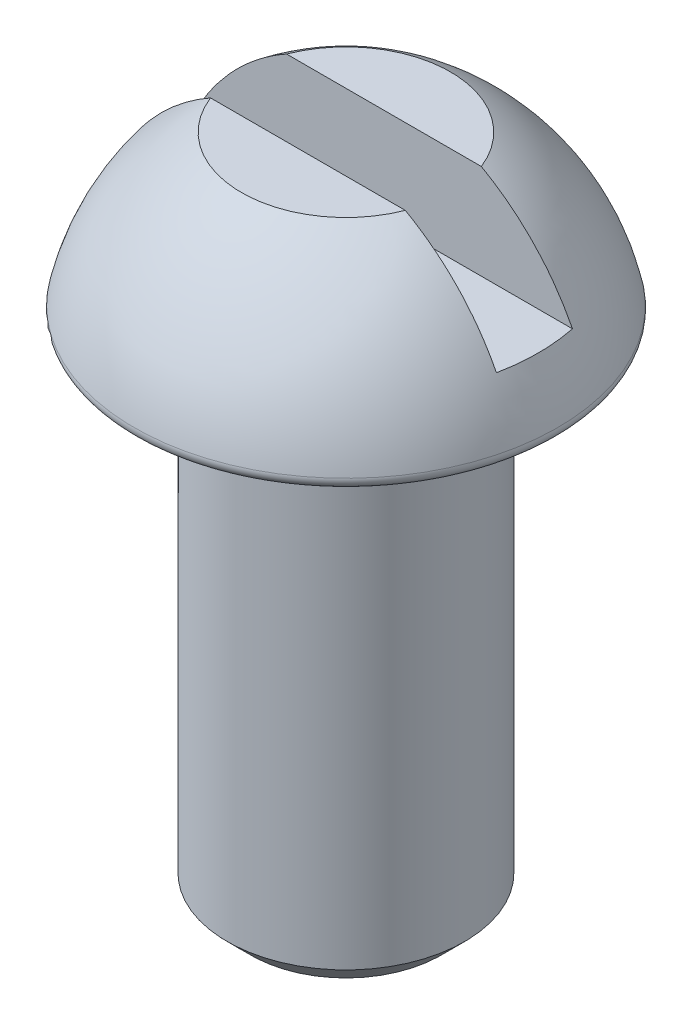
ISO-10303-21;
HEADER;
FILE_DESCRIPTION(('STEP AP214'),'2;1');
FILE_NAME('part.step','',(''),(''),'','','');
FILE_SCHEMA(('AUTOMOTIVE_DESIGN { 1 0 10303 214 1 1 1 1 }'));
ENDSEC;
DATA;
#1=APPLICATION_CONTEXT('core data for automotive mechanical design processes');
#2=APPLICATION_PROTOCOL_DEFINITION('international standard','automotive_design',2000,#1);
#3=PRODUCT_CONTEXT('',#1,'mechanical');
#4=PRODUCT('Part','Part','',(#3));
#5=PRODUCT_RELATED_PRODUCT_CATEGORY('part','',(#4));
#6=PRODUCT_DEFINITION_FORMATION('','',#4);
#7=PRODUCT_DEFINITION_CONTEXT('part definition',#1,'design');
#8=PRODUCT_DEFINITION('design','',#6,#7);
#9=PRODUCT_DEFINITION_SHAPE('','',#8);
#10=(LENGTH_UNIT() NAMED_UNIT(*) SI_UNIT(.MILLI.,.METRE.));
#11=(NAMED_UNIT(*) PLANE_ANGLE_UNIT() SI_UNIT($,.RADIAN.));
#12=(NAMED_UNIT(*) SI_UNIT($,.STERADIAN.) SOLID_ANGLE_UNIT());
#13=UNCERTAINTY_MEASURE_WITH_UNIT(LENGTH_MEASURE(1.E-05),#10,'distance_accuracy_value','');
#14=(GEOMETRIC_REPRESENTATION_CONTEXT(3) GLOBAL_UNCERTAINTY_ASSIGNED_CONTEXT((#13)) GLOBAL_UNIT_ASSIGNED_CONTEXT((#10,
#11,#12)) REPRESENTATION_CONTEXT('',''));
#15=CARTESIAN_POINT('',(0.,0.,0.));
#16=DIRECTION('',(0.,0.,1.));
#17=DIRECTION('',(1.,0.,0.));
#18=AXIS2_PLACEMENT_3D('',#15,#16,#17);
#19=CARTESIAN_POINT('',(0.,7.,0.));
#20=DIRECTION('',(0.,1.,0.));
#21=DIRECTION('',(0.,0.,1.));
#22=AXIS2_PLACEMENT_3D('',#19,#20,#21);
#23=PLANE('',#22);
#24=DIRECTION('',(-1.,0.,0.));
#25=VECTOR('',#24,1.);
#26=CARTESIAN_POINT('',(-2.5,7.,-0.4));
#27=LINE('',#26,#25);
#28=CARTESIAN_POINT('',(1.02469507659596,7.,-0.4));
#29=VERTEX_POINT('',#28);
#30=CARTESIAN_POINT('',(-1.02469507659596,7.,-0.4));
#31=VERTEX_POINT('',#30);
#32=EDGE_CURVE('E83',#29,#31,#27,.T.);
#33=ORIENTED_EDGE('',*,*,#32,.F.);
#34=CARTESIAN_POINT('',(0.,7.,0.));
#35=DIRECTION('',(0.,-1.,0.));
#36=DIRECTION('',(0.,0.,-1.));
#37=AXIS2_PLACEMENT_3D('',#34,#35,#36);
#38=CIRCLE('',#37,1.1);
#39=EDGE_CURVE('E90',#31,#29,#38,.T.);
#40=ORIENTED_EDGE('',*,*,#39,.F.);
#41=EDGE_LOOP('',(#33,#40));
#42=FACE_BOUND('',#41,.T.);
#43=ADVANCED_FACE('F29',(#42),#23,.T.);
#44=CARTESIAN_POINT('',(1.,0.,0.));
#45=DIRECTION('',(0.,-1.,0.));
#46=DIRECTION('',(0.,0.,-1.));
#47=AXIS2_PLACEMENT_3D('',#44,#45,#46);
#48=PLANE('',#47);
#49=CARTESIAN_POINT('',(0.,0.,0.));
#50=DIRECTION('',(0.,-1.,0.));
#51=DIRECTION('',(0.,0.,-1.));
#52=AXIS2_PLACEMENT_3D('',#49,#50,#51);
#53=CIRCLE('',#52,1.);
#54=CARTESIAN_POINT('',(0.,0.,-1.));
#55=VERTEX_POINT('',#54);
#56=EDGE_CURVE('E188',#55,#55,#53,.T.);
#57=ORIENTED_EDGE('',*,*,#56,.T.);
#58=EDGE_LOOP('',(#57));
#59=FACE_BOUND('',#58,.T.);
#60=ADVANCED_FACE('F31',(#59),#48,.T.);
#61=DIRECTION('',(1.,0.,0.));
#62=VECTOR('',#61,1.);
#63=CARTESIAN_POINT('',(-2.5,7.,0.4));
#64=LINE('',#63,#62);
#65=CARTESIAN_POINT('',(-1.02469507659596,7.,0.4));
#66=VERTEX_POINT('',#65);
#67=CARTESIAN_POINT('',(1.02469507659596,7.,0.4));
#68=VERTEX_POINT('',#67);
#69=EDGE_CURVE('E74',#66,#68,#64,.T.);
#70=ORIENTED_EDGE('',*,*,#69,.F.);
#71=EDGE_CURVE('E82',#68,#66,#38,.T.);
#72=ORIENTED_EDGE('',*,*,#71,.F.);
#73=EDGE_LOOP('',(#70,#72));
#74=FACE_BOUND('',#73,.T.);
#75=ADVANCED_FACE('F81',(#74),#23,.T.);
#76=CARTESIAN_POINT('',(0.,4.9063677010287,0.));
#77=DIRECTION('',(0.,-1.,0.));
#78=DIRECTION('',(0.,0.,-1.));
#79=AXIS2_PLACEMENT_3D('',#76,#77,#78);
#80=DEGENERATE_TOROIDAL_SURFACE('',#79,0.163412963696707,2.44530335953083,.F.);
#81=CARTESIAN_POINT('',(0.,7.28587906945526,-0.4));
#82=CARTESIAN_POINT('',(-0.0340393368764344,7.28587853967351,-0.4));
#83=CARTESIAN_POINT('',(-0.0680806385514161,7.28484475528946,-0.4));
#84=CARTESIAN_POINT('',(-0.136044239585214,7.28077151304844,-0.4));
#85=CARTESIAN_POINT('',(-0.169966512688445,7.27773163759928,-0.4));
#86=CARTESIAN_POINT('',(-0.27153522568853,7.26581085311434,-0.4));
#87=CARTESIAN_POINT('',(-0.338865413936364,7.25412964589655,-0.4));
#88=CARTESIAN_POINT('',(-0.466840374817371,7.22550258789054,-0.4));
#89=CARTESIAN_POINT('',(-0.527596444172791,7.20903942718526,-0.4));
#90=CARTESIAN_POINT('',(-0.647532675073714,7.17108725806298,-0.4));
#91=CARTESIAN_POINT('',(-0.706712127812102,7.14959603024963,-0.4));
#92=CARTESIAN_POINT('',(-0.881413612269339,7.07797897531619,-0.4));
#93=CARTESIAN_POINT('',(-0.994091656053262,7.02071142271362,-0.4));
#94=CARTESIAN_POINT('',(-1.21116046265258,6.88771713623111,-0.4));
#95=CARTESIAN_POINT('',(-1.31532763151112,6.81162817480206,-0.4));
#96=CARTESIAN_POINT('',(-1.51007306014535,6.64375696307232,-0.4));
#97=CARTESIAN_POINT('',(-1.60065669909113,6.55198095592209,-0.4));
#98=CARTESIAN_POINT('',(-1.76975904942326,6.35061889292395,-0.4));
#99=CARTESIAN_POINT('',(-1.84753891070049,6.24041137940083,-0.4));
#100=CARTESIAN_POINT('',(-1.98362855406321,6.00853234315382,-0.4));
#101=CARTESIAN_POINT('',(-2.04193267740705,5.88685750170236,-0.4));
#102=CARTESIAN_POINT('',(-2.1376824501636,5.63480411787153,-0.4));
#103=CARTESIAN_POINT('',(-2.17501384545688,5.50438215167385,-0.4));
#104=CARTESIAN_POINT('',(-2.22727723132415,5.23913721296155,-0.4));
#105=CARTESIAN_POINT('',(-2.24221099433487,5.10431458955579,-0.4));
#106=CARTESIAN_POINT('',(-2.24926993668814,4.83390653047334,-0.4));
#107=CARTESIAN_POINT('',(-2.24136701233477,4.69832036000992,-0.4));
#108=CARTESIAN_POINT('',(-2.20291218260897,4.43038250775117,-0.4));
#109=CARTESIAN_POINT('',(-2.17235759497554,4.29803121092566,-0.4));
#110=CARTESIAN_POINT('',(-2.08944879829779,4.04031190752979,-0.4));
#111=CARTESIAN_POINT('',(-2.03709019684448,3.91494531379748,-0.4));
#112=CARTESIAN_POINT('',(-1.91207043137878,3.67483254586974,-0.4));
#113=CARTESIAN_POINT('',(-1.83941581092892,3.56008296453046,-0.4));
#114=CARTESIAN_POINT('',(-1.67592713754524,3.34455651568706,-0.4));
#115=CARTESIAN_POINT('',(-1.58511363317758,3.24376407055755,-0.4));
#116=CARTESIAN_POINT('',(-1.38774011243226,3.05884052152001,-0.4));
#117=CARTESIAN_POINT('',(-1.28116673495222,2.97472369811192,-0.4));
#118=CARTESIAN_POINT('',(-1.05560673365431,2.82599968716567,-0.4));
#119=CARTESIAN_POINT('',(-0.936664513213116,2.76132574759789,-0.4));
#120=CARTESIAN_POINT('',(-0.751407583590142,2.68045704661845,-0.4));
#121=CARTESIAN_POINT('',(-0.688506723571065,2.65618923998029,-0.4));
#122=CARTESIAN_POINT('',(-0.560809849612972,2.61333912978168,-0.4));
#123=CARTESIAN_POINT('',(-0.496015087546172,2.59475315964231,-0.4));
#124=CARTESIAN_POINT('',(-0.379774606237006,2.5672698320534,-0.4));
#125=CARTESIAN_POINT('',(-0.328619562875833,2.55713229881348,-0.4));
#126=CARTESIAN_POINT('',(-0.225675136010375,2.54096626324747,-0.4));
#127=CARTESIAN_POINT('',(-0.173886094450959,2.53493563736659,-0.4));
#128=CARTESIAN_POINT('',(-0.0700672977772675,2.52753539788831,-0.4));
#129=CARTESIAN_POINT('',(-0.0180382267348041,2.52615653315214,-0.4));
#130=CARTESIAN_POINT('',(0.0859275445104696,2.52823788363376,-0.4));
#131=CARTESIAN_POINT('',(0.137864226676698,2.53169895789791,-0.4));
#132=CARTESIAN_POINT('',(0.241030783474831,2.54299346691428,-0.4));
#133=CARTESIAN_POINT('',(0.292262684514633,2.55080889246069,-0.4));
#134=CARTESIAN_POINT('',(0.393976932056873,2.57030181276681,-0.4));
#135=CARTESIAN_POINT('',(0.444459169899048,2.58197986179579,-0.4));
#136=CARTESIAN_POINT('',(0.594730991121212,2.62238904149137,-0.4));
#137=CARTESIAN_POINT('',(0.693119997637176,2.65646756311099,-0.4));
#138=CARTESIAN_POINT('',(0.899096302338096,2.74360684666299,-0.4));
#139=CARTESIAN_POINT('',(1.00578918805161,2.7987735589278,-0.4));
#140=CARTESIAN_POINT('',(1.2095306894791,2.92446282577751,-0.4));
#141=CARTESIAN_POINT('',(1.3065892215671,2.99496934777388,-0.4));
#142=CARTESIAN_POINT('',(1.49936637066893,3.15842123448225,-0.4));
#143=CARTESIAN_POINT('',(1.59370796589346,3.25299801985645,-0.4));
#144=CARTESIAN_POINT('',(1.76548574993324,3.45653186078382,-0.4));
#145=CARTESIAN_POINT('',(1.84290866128105,3.56550010366153,-0.400000000000001));
#146=CARTESIAN_POINT('',(1.97954271851369,3.79623547144408,-0.400000000000001));
#147=CARTESIAN_POINT('',(2.03850519368131,3.91814999080063,-0.400000000000001));
#148=CARTESIAN_POINT('',(2.13517330555109,4.17010580424191,-0.400000000000001));
#149=CARTESIAN_POINT('',(2.17288258131227,4.30014570282782,-0.400000000000001));
#150=CARTESIAN_POINT('',(2.2260778635617,4.56505890532003,-0.400000000000001));
#151=CARTESIAN_POINT('',(2.24150400946743,4.69994423454143,-0.400000000000001));
#152=CARTESIAN_POINT('',(2.2495063262544,4.97039525151681,-0.400000000000001));
#153=CARTESIAN_POINT('',(2.24208167112069,5.10596096368853,-0.400000000000001));
#154=CARTESIAN_POINT('',(2.20458033624675,5.37399416240919,-0.400000000000001));
#155=CARTESIAN_POINT('',(2.1744919707742,5.5064600142837,-0.400000000000001));
#156=CARTESIAN_POINT('',(2.09249452405155,5.76446764695252,-0.400000000000001));
#157=CARTESIAN_POINT('',(2.04058386673732,5.89000892689483,-0.400000000000001));
#158=CARTESIAN_POINT('',(1.91641700364703,6.13056049322057,-0.400000000000001));
#159=CARTESIAN_POINT('',(1.84416482376025,6.24557285746997,-0.4));
#160=CARTESIAN_POINT('',(1.68136746837599,6.461775690562,-0.4));
#161=CARTESIAN_POINT('',(1.59082775313349,6.56297027001061,-0.4));
#162=CARTESIAN_POINT('',(1.3941945302079,6.74845601350238,-0.4));
#163=CARTESIAN_POINT('',(1.28813449363465,6.8327826511548,-0.4));
#164=CARTESIAN_POINT('',(1.06314313787397,6.98236095327679,-0.4));
#165=CARTESIAN_POINT('',(0.944198271921474,7.04759226946018,-0.4));
#166=CARTESIAN_POINT('',(0.715299164870537,7.1484629340234,-0.4));
#167=CARTESIAN_POINT('',(0.606656148742175,7.18706715788623,-0.4));
#168=CARTESIAN_POINT('',(0.440416489854842,7.23187809206629,-0.4));
#169=CARTESIAN_POINT('',(0.384530639800241,7.24462456903748,-0.4));
#170=CARTESIAN_POINT('',(0.271892314434501,7.26533379827434,-0.4));
#171=CARTESIAN_POINT('',(0.215140631021157,7.27330068115763,-0.4));
#172=CARTESIAN_POINT('',(0.131860718248229,7.28096128698197,-0.4));
#173=CARTESIAN_POINT('',(0.105518733111906,7.28279980609938,-0.4));
#174=CARTESIAN_POINT('',(0.0527848795277882,7.2852587021146,-0.4));
#175=CARTESIAN_POINT('',(0.0263930303787491,7.28587948023136,-0.4));
#176=CARTESIAN_POINT('',(0.,7.28587906945526,-0.4));
#177=B_SPLINE_CURVE_WITH_KNOTS('',3,(#81,#82,#83,#84,#85,#86,#87,#88,#89,#90,#91,#92,#93,#94,
#95,#96,#97,#98,#99,#100,#101,#102,#103,#104,#105,#106,#107,#108,#109,#110,#111,#112,#113,#114,
#115,#116,#117,#118,#119,#120,#121,#122,#123,#124,#125,#126,#127,#128,#129,#130,#131,#132,#133,
#134,#135,#136,#137,#138,#139,#140,#141,#142,#143,#144,#145,#146,#147,#148,#149,#150,#151,#152,
#153,#154,#155,#156,#157,#158,#159,#160,#161,#162,#163,#164,#165,#166,#167,#168,#169,#170,#171,
#172,#173,#174,#175,#176),.UNSPECIFIED.,.T.,.F.,(4,2,2,2,2,2,2,2,2,2,2,2,2,2,2,2,2,2,2,2,2,2,2,
2,2,2,2,2,2,2,2,2,2,2,2,2,2,2,2,2,2,2,2,2,2,2,2,4),(0.,0.102105086593573,0.204231434307442,
0.408836543729974,0.597454184383687,0.786155238747507,1.16357899186871,1.54892487610662,
1.93411775546429,2.33688174811018,2.73976266361433,3.14481760260444,3.54984048587873,
3.95536201790846,4.36093157680271,4.76658287705932,5.172103543462,5.57716789407863,
5.98257764519323,6.38657920134046,6.58862842465047,6.79054698582301,6.94685600559813,
7.10308414132193,7.25900139632302,7.41494632877032,7.57025102423061,7.7255780148981,
8.03690773063866,8.39584948680008,8.75441787754501,9.15329246948661,9.55247897545222,
9.95683187303509,10.3611155146244,10.7664832020485,11.1718655429502,11.5774570479722,
11.9830778509286,12.388618431873,12.7940381058561,13.1985959970318,13.6035834353416,
13.9480728882159,14.119880694076,14.2915398056141,14.3707349733162,14.449904043562),.UNSPECIFIED.);
#178=CARTESIAN_POINT('',(-1.98377782471078,6.,-0.4));
#179=VERTEX_POINT('',#178);
#180=EDGE_CURVE('E11',#31,#179,#177,.T.);
#181=ORIENTED_EDGE('',*,*,#180,.F.);
#182=ORIENTED_EDGE('',*,*,#39,.T.);
#183=CARTESIAN_POINT('',(1.98377782471078,6.,-0.400000000000001));
#184=VERTEX_POINT('',#183);
#185=EDGE_CURVE('E33',#184,#29,#177,.T.);
#186=ORIENTED_EDGE('',*,*,#185,.F.);
#187=CARTESIAN_POINT('',(0.,6.,0.));
#188=DIRECTION('',(0.,1.,0.));
#189=DIRECTION('',(0.,0.,1.));
#190=AXIS2_PLACEMENT_3D('',#187,#188,#189);
#191=CIRCLE('',#190,2.02370315456942);
#192=CARTESIAN_POINT('',(1.98377782471078,6.,0.4));
#193=VERTEX_POINT('',#192);
#194=EDGE_CURVE('E102',#184,#193,#191,.F.);
#195=ORIENTED_EDGE('',*,*,#194,.T.);
#196=CARTESIAN_POINT('',(0.,7.28587906945526,0.4));
#197=CARTESIAN_POINT('',(0.0340393368764344,7.28587853967351,0.4));
#198=CARTESIAN_POINT('',(0.068080638551416,7.28484475528946,0.4));
#199=CARTESIAN_POINT('',(0.136044239585214,7.28077151304844,0.4));
#200=CARTESIAN_POINT('',(0.169966512688445,7.27773163759928,0.4));
#201=CARTESIAN_POINT('',(0.27153522568853,7.26581085311434,0.4));
#202=CARTESIAN_POINT('',(0.338865413936364,7.25412964589655,0.4));
#203=CARTESIAN_POINT('',(0.46684037481737,7.22550258789054,0.4));
#204=CARTESIAN_POINT('',(0.527596444172791,7.20903942718526,0.4));
#205=CARTESIAN_POINT('',(0.647532675073713,7.17108725806298,0.4));
#206=CARTESIAN_POINT('',(0.706712127812102,7.14959603024963,0.4));
#207=CARTESIAN_POINT('',(0.881413612269338,7.07797897531619,0.4));
#208=CARTESIAN_POINT('',(0.994091656053262,7.02071142271362,0.4));
#209=CARTESIAN_POINT('',(1.21116046265258,6.88771713623111,0.4));
#210=CARTESIAN_POINT('',(1.31532763151112,6.81162817480206,0.4));
#211=CARTESIAN_POINT('',(1.51007306014535,6.64375696307232,0.4));
#212=CARTESIAN_POINT('',(1.60065669909113,6.55198095592209,0.4));
#213=CARTESIAN_POINT('',(1.76975904942326,6.35061889292395,0.4));
#214=CARTESIAN_POINT('',(1.84753891070049,6.24041137940083,0.4));
#215=CARTESIAN_POINT('',(1.98362855406321,6.00853234315382,0.4));
#216=CARTESIAN_POINT('',(2.04193267740705,5.88685750170236,0.4));
#217=CARTESIAN_POINT('',(2.1376824501636,5.63480411787153,0.4));
#218=CARTESIAN_POINT('',(2.17501384545688,5.50438215167385,0.4));
#219=CARTESIAN_POINT('',(2.22727723132415,5.23913721296155,0.4));
#220=CARTESIAN_POINT('',(2.24221099433487,5.10431458955579,0.4));
#221=CARTESIAN_POINT('',(2.24926993668814,4.83390653047334,0.4));
#222=CARTESIAN_POINT('',(2.24136701233477,4.69832036000992,0.4));
#223=CARTESIAN_POINT('',(2.20291218260897,4.43038250775117,0.4));
#224=CARTESIAN_POINT('',(2.17235759497554,4.29803121092566,0.4));
#225=CARTESIAN_POINT('',(2.08944879829779,4.04031190752979,0.4));
#226=CARTESIAN_POINT('',(2.03709019684448,3.91494531379748,0.4));
#227=CARTESIAN_POINT('',(1.91207043137878,3.67483254586974,0.4));
#228=CARTESIAN_POINT('',(1.83941581092892,3.56008296453046,0.4));
#229=CARTESIAN_POINT('',(1.67592713754524,3.34455651568706,0.4));
#230=CARTESIAN_POINT('',(1.58511363317758,3.24376407055755,0.4));
#231=CARTESIAN_POINT('',(1.38774011243226,3.05884052152001,0.4));
#232=CARTESIAN_POINT('',(1.28116673495222,2.97472369811191,0.4));
#233=CARTESIAN_POINT('',(1.05560673365431,2.82599968716567,0.4));
#234=CARTESIAN_POINT('',(0.936664513213116,2.76132574759789,0.4));
#235=CARTESIAN_POINT('',(0.751407583590142,2.68045704661845,0.4));
#236=CARTESIAN_POINT('',(0.688506723571065,2.65618923998029,0.4));
#237=CARTESIAN_POINT('',(0.560809849612973,2.61333912978168,0.4));
#238=CARTESIAN_POINT('',(0.496015087546172,2.59475315964231,0.4));
#239=CARTESIAN_POINT('',(0.379774606237006,2.5672698320534,0.4));
#240=CARTESIAN_POINT('',(0.328619562875833,2.55713229881348,0.4));
#241=CARTESIAN_POINT('',(0.225675136010375,2.54096626324747,0.4));
#242=CARTESIAN_POINT('',(0.17388609445096,2.53493563736659,0.4));
#243=CARTESIAN_POINT('',(0.0700672977772686,2.52753539788831,0.4));
#244=CARTESIAN_POINT('',(0.018038226734805,2.52615653315214,0.4));
#245=CARTESIAN_POINT('',(-0.085927544510469,2.52823788363376,0.4));
#246=CARTESIAN_POINT('',(-0.137864226676698,2.53169895789791,0.4));
#247=CARTESIAN_POINT('',(-0.24103078347483,2.54299346691428,0.4));
#248=CARTESIAN_POINT('',(-0.292262684514631,2.55080889246069,0.4));
#249=CARTESIAN_POINT('',(-0.393976932056872,2.57030181276681,0.4));
#250=CARTESIAN_POINT('',(-0.444459169899047,2.58197986179579,0.4));
#251=CARTESIAN_POINT('',(-0.594730991121211,2.62238904149137,0.4));
#252=CARTESIAN_POINT('',(-0.693119997637175,2.65646756311099,0.4));
#253=CARTESIAN_POINT('',(-0.899096302338096,2.74360684666299,0.4));
#254=CARTESIAN_POINT('',(-1.00578918805161,2.79877355892779,0.4));
#255=CARTESIAN_POINT('',(-1.2095306894791,2.92446282577751,0.4));
#256=CARTESIAN_POINT('',(-1.3065892215671,2.99496934777387,0.4));
#257=CARTESIAN_POINT('',(-1.49936637066893,3.15842123448225,0.4));
#258=CARTESIAN_POINT('',(-1.59370796589346,3.25299801985645,0.4));
#259=CARTESIAN_POINT('',(-1.76548574993324,3.45653186078382,0.4));
#260=CARTESIAN_POINT('',(-1.84290866128105,3.56550010366153,0.4));
#261=CARTESIAN_POINT('',(-1.97954271851369,3.79623547144408,0.4));
#262=CARTESIAN_POINT('',(-2.03850519368131,3.91814999080063,0.4));
#263=CARTESIAN_POINT('',(-2.13517330555109,4.17010580424191,0.4));
#264=CARTESIAN_POINT('',(-2.17288258131227,4.30014570282781,0.4));
#265=CARTESIAN_POINT('',(-2.2260778635617,4.56505890532003,0.4));
#266=CARTESIAN_POINT('',(-2.24150400946743,4.69994423454143,0.4));
#267=CARTESIAN_POINT('',(-2.2495063262544,4.9703952515168,0.4));
#268=CARTESIAN_POINT('',(-2.24208167112069,5.10596096368853,0.4));
#269=CARTESIAN_POINT('',(-2.20458033624675,5.37399416240919,0.4));
#270=CARTESIAN_POINT('',(-2.1744919707742,5.50646001428369,0.4));
#271=CARTESIAN_POINT('',(-2.09249452405155,5.76446764695252,0.4));
#272=CARTESIAN_POINT('',(-2.04058386673732,5.89000892689483,0.4));
#273=CARTESIAN_POINT('',(-1.91641700364703,6.13056049322057,0.4));
#274=CARTESIAN_POINT('',(-1.84416482376025,6.24557285746996,0.4));
#275=CARTESIAN_POINT('',(-1.68136746837599,6.461775690562,0.4));
#276=CARTESIAN_POINT('',(-1.59082775313349,6.56297027001061,0.4));
#277=CARTESIAN_POINT('',(-1.3941945302079,6.74845601350238,0.4));
#278=CARTESIAN_POINT('',(-1.28813449363465,6.83278265115479,0.4));
#279=CARTESIAN_POINT('',(-1.06314313787397,6.98236095327679,0.4));
#280=CARTESIAN_POINT('',(-0.944198271921475,7.04759226946018,0.4));
#281=CARTESIAN_POINT('',(-0.715299164870538,7.1484629340234,0.4));
#282=CARTESIAN_POINT('',(-0.606656148742177,7.18706715788623,0.4));
#283=CARTESIAN_POINT('',(-0.440416489854844,7.23187809206629,0.4));
#284=CARTESIAN_POINT('',(-0.384530639800243,7.24462456903748,0.4));
#285=CARTESIAN_POINT('',(-0.271892314434502,7.26533379827434,0.4));
#286=CARTESIAN_POINT('',(-0.215140631021158,7.27330068115763,0.4));
#287=CARTESIAN_POINT('',(-0.131860718248229,7.28096128698197,0.4));
#288=CARTESIAN_POINT('',(-0.105518733111905,7.28279980609938,0.4));
#289=CARTESIAN_POINT('',(-0.0527848795277873,7.2852587021146,0.4));
#290=CARTESIAN_POINT('',(-0.0263930303787487,7.28587948023136,0.4));
#291=CARTESIAN_POINT('',(0.,7.28587906945526,0.4));
#292=B_SPLINE_CURVE_WITH_KNOTS('',3,(#196,#197,#198,#199,#200,#201,#202,#203,#204,#205,#206,
#207,#208,#209,#210,#211,#212,#213,#214,#215,#216,#217,#218,#219,#220,#221,#222,#223,#224,#225,
#226,#227,#228,#229,#230,#231,#232,#233,#234,#235,#236,#237,#238,#239,#240,#241,#242,#243,#244,
#245,#246,#247,#248,#249,#250,#251,#252,#253,#254,#255,#256,#257,#258,#259,#260,#261,#262,#263,
#264,#265,#266,#267,#268,#269,#270,#271,#272,#273,#274,#275,#276,#277,#278,#279,#280,#281,#282,
#283,#284,#285,#286,#287,#288,#289,#290,#291),.UNSPECIFIED.,.T.,.F.,(4,2,2,2,2,2,2,2,2,2,2,2,2,
2,2,2,2,2,2,2,2,2,2,2,2,2,2,2,2,2,2,2,2,2,2,2,2,2,2,2,2,2,2,2,2,2,2,4),(0.,0.102105086593573,
0.204231434307442,0.408836543729973,0.597454184383686,0.786155238747506,1.16357899186871,
1.54892487610662,1.93411775546429,2.33688174811018,2.73976266361433,3.14481760260444,
3.54984048587873,3.95536201790846,4.36093157680271,4.76658287705932,5.172103543462,
5.57716789407863,5.98257764519323,6.38657920134046,6.58862842465047,6.79054698582301,
6.94685600559813,7.10308414132192,7.25900139632302,7.41494632877032,7.57025102423061,
7.7255780148981,8.03690773063865,8.39584948680008,8.754417877545,9.15329246948661,
9.55247897545222,9.95683187303509,10.3611155146244,10.7664832020485,11.1718655429502,
11.5774570479722,11.9830778509286,12.388618431873,12.794038105856,13.1985959970318,
13.6035834353416,13.9480728882159,14.119880694076,14.2915398056141,14.3707349733162,
14.4499040435619),.UNSPECIFIED.);
#293=EDGE_CURVE('E78',#68,#193,#292,.T.);
#294=ORIENTED_EDGE('',*,*,#293,.F.);
#295=ORIENTED_EDGE('',*,*,#71,.T.);
#296=CARTESIAN_POINT('',(-1.98377782471078,6.,0.4));
#297=VERTEX_POINT('',#296);
#298=EDGE_CURVE('E42',#297,#66,#292,.T.);
#299=ORIENTED_EDGE('',*,*,#298,.F.);
#300=EDGE_CURVE('E54',#297,#179,#191,.F.);
#301=ORIENTED_EDGE('',*,*,#300,.T.);
#302=EDGE_LOOP('',(#181,#182,#186,#195,#294,#295,#299,#301));
#303=FACE_BOUND('',#302,.T.);
#304=CARTESIAN_POINT('',(0.,5.42104769504402,0.));
#305=DIRECTION('',(0.,-1.,0.));
#306=DIRECTION('',(0.,0.,-1.));
#307=AXIS2_PLACEMENT_3D('',#304,#305,#306);
#308=CIRCLE('',#307,2.22711271570796);
#309=CARTESIAN_POINT('',(0.,5.42104769504402,-2.22711271570796));
#310=VERTEX_POINT('',#309);
#311=EDGE_CURVE('E93',#310,#310,#308,.F.);
#312=ORIENTED_EDGE('',*,*,#311,.T.);
#313=EDGE_LOOP('',(#312));
#314=FACE_BOUND('',#313,.T.);
#315=ADVANCED_FACE('F86',(#303,#314),#80,.F.);
#316=CARTESIAN_POINT('',(2.25,5.3,0.));
#317=DIRECTION('',(0.,-1.,0.));
#318=DIRECTION('',(0.,0.,-1.));
#319=AXIS2_PLACEMENT_3D('',#316,#317,#318);
#320=PLANE('',#319);
#321=CARTESIAN_POINT('',(0.,5.3,0.));
#322=DIRECTION('',(0.,-1.,0.));
#323=DIRECTION('',(0.,0.,-1.));
#324=AXIS2_PLACEMENT_3D('',#321,#322,#323);
#325=CIRCLE('',#324,2.12935283368402);
#326=CARTESIAN_POINT('',(0.,5.3,-2.12935283368402));
#327=VERTEX_POINT('',#326);
#328=EDGE_CURVE('E89',#327,#327,#325,.T.);
#329=ORIENTED_EDGE('',*,*,#328,.T.);
#330=EDGE_LOOP('',(#329));
#331=FACE_BOUND('',#330,.T.);
#332=CARTESIAN_POINT('',(0.,5.3,0.));
#333=DIRECTION('',(0.,-1.,0.));
#334=DIRECTION('',(0.,0.,-1.));
#335=AXIS2_PLACEMENT_3D('',#332,#333,#334);
#336=CIRCLE('',#335,1.25);
#337=CARTESIAN_POINT('',(0.,5.3,-1.25));
#338=VERTEX_POINT('',#337);
#339=EDGE_CURVE('E96',#338,#338,#336,.T.);
#340=ORIENTED_EDGE('',*,*,#339,.F.);
#341=EDGE_LOOP('',(#340));
#342=FACE_BOUND('',#341,.T.);
#343=ADVANCED_FACE('F125',(#331,#342),#320,.T.);
#344=CARTESIAN_POINT('',(0.,0.,0.));
#345=DIRECTION('',(0.,-1.,0.));
#346=DIRECTION('',(0.,0.,-1.));
#347=AXIS2_PLACEMENT_3D('',#344,#345,#346);
#348=CYLINDRICAL_SURFACE('',#347,1.25);
#349=ORIENTED_EDGE('',*,*,#339,.T.);
#350=EDGE_LOOP('',(#349));
#351=FACE_BOUND('',#350,.T.);
#352=CARTESIAN_POINT('',(0.,0.250000000000001,0.));
#353=DIRECTION('',(0.,-1.,0.));
#354=DIRECTION('',(0.,0.,-1.));
#355=AXIS2_PLACEMENT_3D('',#352,#353,#354);
#356=CIRCLE('',#355,1.25);
#357=CARTESIAN_POINT('',(0.,0.250000000000001,-1.25));
#358=VERTEX_POINT('',#357);
#359=EDGE_CURVE('E194',#358,#358,#356,.T.);
#360=ORIENTED_EDGE('',*,*,#359,.F.);
#361=EDGE_LOOP('',(#360));
#362=FACE_BOUND('',#361,.T.);
#363=ADVANCED_FACE('F122',(#351,#362),#348,.T.);
#364=CARTESIAN_POINT('',(0.,0.,0.));
#365=DIRECTION('',(0.,1.,0.));
#366=DIRECTION('',(0.,0.,1.));
#367=AXIS2_PLACEMENT_3D('',#364,#365,#366);
#368=CONICAL_SURFACE('',#367,1.,0.785398163397447);
#369=ORIENTED_EDGE('',*,*,#359,.T.);
#370=EDGE_LOOP('',(#369));
#371=FACE_BOUND('',#370,.T.);
#372=ORIENTED_EDGE('',*,*,#56,.F.);
#373=EDGE_LOOP('',(#372));
#374=FACE_BOUND('',#373,.T.);
#375=ADVANCED_FACE('F118',(#371,#374),#368,.T.);
#376=CARTESIAN_POINT('',(0.,5.4,0.));
#377=DIRECTION('',(0.,-1.,0.));
#378=DIRECTION('',(0.,0.,-1.));
#379=AXIS2_PLACEMENT_3D('',#376,#377,#378);
#380=TOROIDAL_SURFACE('',#379,2.12935283368402,0.1);
#381=ORIENTED_EDGE('',*,*,#311,.F.);
#382=EDGE_LOOP('',(#381));
#383=FACE_BOUND('',#382,.T.);
#384=ORIENTED_EDGE('',*,*,#328,.F.);
#385=EDGE_LOOP('',(#384));
#386=FACE_BOUND('',#385,.T.);
#387=ADVANCED_FACE('F115',(#383,#386),#380,.T.);
#388=CARTESIAN_POINT('',(-2.5,6.,-0.4));
#389=DIRECTION('',(0.,0.,-1.));
#390=DIRECTION('',(-1.,0.,0.));
#391=AXIS2_PLACEMENT_3D('',#388,#389,#390);
#392=PLANE('',#391);
#393=ORIENTED_EDGE('',*,*,#180,.T.);
#394=DIRECTION('',(-1.,0.,0.));
#395=VECTOR('',#394,1.);
#396=CARTESIAN_POINT('',(-2.5,6.,-0.4));
#397=LINE('',#396,#395);
#398=EDGE_CURVE('E185',#184,#179,#397,.T.);
#399=ORIENTED_EDGE('',*,*,#398,.F.);
#400=ORIENTED_EDGE('',*,*,#185,.T.);
#401=ORIENTED_EDGE('',*,*,#32,.T.);
#402=EDGE_LOOP('',(#393,#399,#400,#401));
#403=FACE_BOUND('',#402,.T.);
#404=ADVANCED_FACE('F112',(#403),#392,.F.);
#405=CARTESIAN_POINT('',(-2.5,6.,0.4));
#406=DIRECTION('',(0.,0.,1.));
#407=DIRECTION('',(1.,0.,0.));
#408=AXIS2_PLACEMENT_3D('',#405,#406,#407);
#409=PLANE('',#408);
#410=ORIENTED_EDGE('',*,*,#293,.T.);
#411=DIRECTION('',(1.,0.,0.));
#412=VECTOR('',#411,1.);
#413=CARTESIAN_POINT('',(-2.5,6.,0.4));
#414=LINE('',#413,#412);
#415=EDGE_CURVE('E49',#297,#193,#414,.T.);
#416=ORIENTED_EDGE('',*,*,#415,.F.);
#417=ORIENTED_EDGE('',*,*,#298,.T.);
#418=ORIENTED_EDGE('',*,*,#69,.T.);
#419=EDGE_LOOP('',(#410,#416,#417,#418));
#420=FACE_BOUND('',#419,.T.);
#421=ADVANCED_FACE('F73',(#420),#409,.F.);
#422=CARTESIAN_POINT('',(-2.5,6.,-0.4));
#423=DIRECTION('',(0.,1.,0.));
#424=DIRECTION('',(0.,0.,1.));
#425=AXIS2_PLACEMENT_3D('',#422,#423,#424);
#426=PLANE('',#425);
#427=ORIENTED_EDGE('',*,*,#415,.T.);
#428=ORIENTED_EDGE('',*,*,#194,.F.);
#429=ORIENTED_EDGE('',*,*,#398,.T.);
#430=ORIENTED_EDGE('',*,*,#300,.F.);
#431=EDGE_LOOP('',(#427,#428,#429,#430));
#432=FACE_BOUND('',#431,.T.);
#433=ADVANCED_FACE('F111',(#432),#426,.T.);
#434=CLOSED_SHELL('',(#43,#60,#75,#315,#343,#363,#375,#387,#404,#421,#433));
#435=MANIFOLD_SOLID_BREP('B2',#434);
#436=ADVANCED_BREP_SHAPE_REPRESENTATION('',(#18,#435),#14);
#437=SHAPE_DEFINITION_REPRESENTATION(#9,#436);
ENDSEC;
END-ISO-10303-21;
